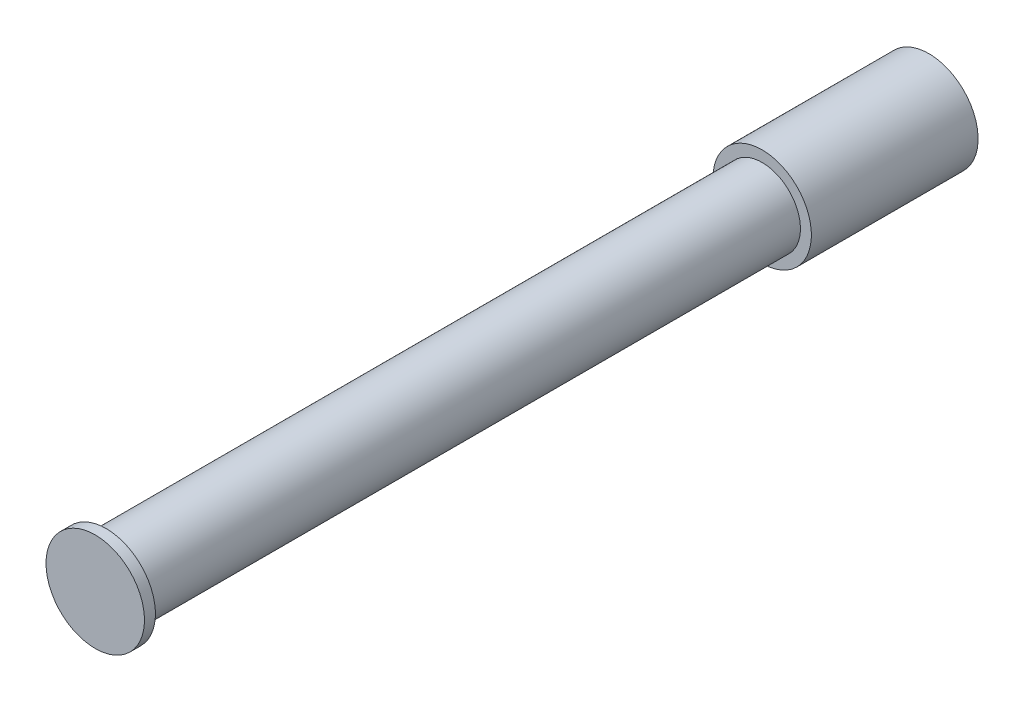
ISO-10303-21;
HEADER;
FILE_DESCRIPTION(('STEP AP214'),'2;1');
FILE_NAME('part.step','',(''),(''),'','','');
FILE_SCHEMA(('AUTOMOTIVE_DESIGN { 1 0 10303 214 1 1 1 1 }'));
ENDSEC;
DATA;
#1=APPLICATION_CONTEXT('core data for automotive mechanical design processes');
#2=APPLICATION_PROTOCOL_DEFINITION('international standard','automotive_design',2000,#1);
#3=PRODUCT_CONTEXT('',#1,'mechanical');
#4=PRODUCT('Part','Part','',(#3));
#5=PRODUCT_RELATED_PRODUCT_CATEGORY('part','',(#4));
#6=PRODUCT_DEFINITION_FORMATION('','',#4);
#7=PRODUCT_DEFINITION_CONTEXT('part definition',#1,'design');
#8=PRODUCT_DEFINITION('design','',#6,#7);
#9=PRODUCT_DEFINITION_SHAPE('','',#8);
#10=(LENGTH_UNIT() NAMED_UNIT(*) SI_UNIT(.MILLI.,.METRE.));
#11=(NAMED_UNIT(*) PLANE_ANGLE_UNIT() SI_UNIT($,.RADIAN.));
#12=(NAMED_UNIT(*) SI_UNIT($,.STERADIAN.) SOLID_ANGLE_UNIT());
#13=UNCERTAINTY_MEASURE_WITH_UNIT(LENGTH_MEASURE(1.E-05),#10,'distance_accuracy_value','');
#14=(GEOMETRIC_REPRESENTATION_CONTEXT(3) GLOBAL_UNCERTAINTY_ASSIGNED_CONTEXT((#13)) GLOBAL_UNIT_ASSIGNED_CONTEXT((#10,
#11,#12)) REPRESENTATION_CONTEXT('',''));
#15=CARTESIAN_POINT('',(0.,0.,0.));
#16=DIRECTION('',(0.,0.,1.));
#17=DIRECTION('',(1.,0.,0.));
#18=AXIS2_PLACEMENT_3D('',#15,#16,#17);
#19=CARTESIAN_POINT('',(0.,5.82639397322076,38.1));
#20=DIRECTION('',(0.,0.,-1.));
#21=DIRECTION('',(-1.,0.,0.));
#22=AXIS2_PLACEMENT_3D('',#19,#20,#21);
#23=CYLINDRICAL_SURFACE('',#22,2.25);
#24=CARTESIAN_POINT('',(0.,5.82639397322076,38.1));
#25=DIRECTION('',(0.,0.,1.));
#26=DIRECTION('',(1.,0.,0.));
#27=AXIS2_PLACEMENT_3D('',#24,#25,#26);
#28=CIRCLE('',#27,2.25);
#29=CARTESIAN_POINT('',(-2.24999999999994,5.82639397322076,38.1));
#30=VERTEX_POINT('',#29);
#31=EDGE_CURVE('E11',#30,#30,#28,.T.);
#32=CARTESIAN_POINT('',(0.,5.82639397322076,37.6));
#33=DIRECTION('',(0.,0.,-1.));
#34=DIRECTION('',(-1.,0.,0.));
#35=AXIS2_PLACEMENT_3D('',#32,#33,#34);
#36=CIRCLE('',#35,2.25);
#37=CARTESIAN_POINT('',(-2.24999999999994,5.82639397322076,37.6));
#38=VERTEX_POINT('',#37);
#39=EDGE_CURVE('E37',#38,#38,#36,.T.);
#40=CARTESIAN_POINT('',(-2.24999999999994,5.82639397322076,38.1));
#41=CARTESIAN_POINT('',(-2.24999999999994,5.82639397322076,38.0947916666667));
#42=CARTESIAN_POINT('',(-2.24999999999994,5.82639397322076,38.0895833333333));
#43=CARTESIAN_POINT('',(-2.24999999999994,5.82639397322076,38.0791666666667));
#44=CARTESIAN_POINT('',(-2.24999999999994,5.82639397322076,38.0739583333333));
#45=CARTESIAN_POINT('',(-2.24999999999994,5.82639397322076,38.0635416666667));
#46=CARTESIAN_POINT('',(-2.24999999999994,5.82639397322076,38.0583333333333));
#47=CARTESIAN_POINT('',(-2.24999999999994,5.82639397322076,38.0479166666667));
#48=CARTESIAN_POINT('',(-2.24999999999994,5.82639397322076,38.0427083333333));
#49=CARTESIAN_POINT('',(-2.24999999999994,5.82639397322076,38.0322916666667));
#50=CARTESIAN_POINT('',(-2.24999999999994,5.82639397322076,38.0270833333333));
#51=CARTESIAN_POINT('',(-2.24999999999994,5.82639397322076,38.0166666666667));
#52=CARTESIAN_POINT('',(-2.24999999999994,5.82639397322076,38.0114583333333));
#53=CARTESIAN_POINT('',(-2.24999999999994,5.82639397322076,38.0010416666667));
#54=CARTESIAN_POINT('',(-2.24999999999994,5.82639397322076,37.9958333333333));
#55=CARTESIAN_POINT('',(-2.24999999999994,5.82639397322076,37.9854166666667));
#56=CARTESIAN_POINT('',(-2.24999999999994,5.82639397322076,37.9802083333333));
#57=CARTESIAN_POINT('',(-2.24999999999994,5.82639397322076,37.9697916666667));
#58=CARTESIAN_POINT('',(-2.24999999999994,5.82639397322076,37.9645833333333));
#59=CARTESIAN_POINT('',(-2.24999999999994,5.82639397322076,37.9541666666667));
#60=CARTESIAN_POINT('',(-2.24999999999994,5.82639397322076,37.9489583333333));
#61=CARTESIAN_POINT('',(-2.24999999999994,5.82639397322076,37.9385416666667));
#62=CARTESIAN_POINT('',(-2.24999999999994,5.82639397322076,37.9333333333333));
#63=CARTESIAN_POINT('',(-2.24999999999994,5.82639397322076,37.9229166666667));
#64=CARTESIAN_POINT('',(-2.24999999999994,5.82639397322076,37.9177083333333));
#65=CARTESIAN_POINT('',(-2.24999999999994,5.82639397322076,37.9072916666667));
#66=CARTESIAN_POINT('',(-2.24999999999994,5.82639397322076,37.9020833333333));
#67=CARTESIAN_POINT('',(-2.24999999999994,5.82639397322076,37.8916666666667));
#68=CARTESIAN_POINT('',(-2.24999999999994,5.82639397322076,37.8864583333333));
#69=CARTESIAN_POINT('',(-2.24999999999994,5.82639397322076,37.8760416666667));
#70=CARTESIAN_POINT('',(-2.24999999999994,5.82639397322076,37.8708333333333));
#71=CARTESIAN_POINT('',(-2.24999999999994,5.82639397322076,37.8604166666667));
#72=CARTESIAN_POINT('',(-2.24999999999994,5.82639397322076,37.8552083333333));
#73=CARTESIAN_POINT('',(-2.24999999999994,5.82639397322076,37.8447916666667));
#74=CARTESIAN_POINT('',(-2.24999999999994,5.82639397322076,37.8395833333333));
#75=CARTESIAN_POINT('',(-2.24999999999994,5.82639397322076,37.8291666666667));
#76=CARTESIAN_POINT('',(-2.24999999999994,5.82639397322076,37.8239583333333));
#77=CARTESIAN_POINT('',(-2.24999999999994,5.82639397322076,37.8135416666667));
#78=CARTESIAN_POINT('',(-2.24999999999994,5.82639397322076,37.8083333333333));
#79=CARTESIAN_POINT('',(-2.24999999999994,5.82639397322076,37.7979166666667));
#80=CARTESIAN_POINT('',(-2.24999999999994,5.82639397322076,37.7927083333333));
#81=CARTESIAN_POINT('',(-2.24999999999994,5.82639397322076,37.7822916666667));
#82=CARTESIAN_POINT('',(-2.24999999999994,5.82639397322076,37.7770833333333));
#83=CARTESIAN_POINT('',(-2.24999999999994,5.82639397322076,37.7666666666667));
#84=CARTESIAN_POINT('',(-2.24999999999994,5.82639397322076,37.7614583333333));
#85=CARTESIAN_POINT('',(-2.24999999999994,5.82639397322076,37.7510416666667));
#86=CARTESIAN_POINT('',(-2.24999999999994,5.82639397322076,37.7458333333333));
#87=CARTESIAN_POINT('',(-2.24999999999994,5.82639397322076,37.7354166666667));
#88=CARTESIAN_POINT('',(-2.24999999999994,5.82639397322076,37.7302083333333));
#89=CARTESIAN_POINT('',(-2.24999999999994,5.82639397322076,37.7197916666667));
#90=CARTESIAN_POINT('',(-2.24999999999994,5.82639397322076,37.7145833333333));
#91=CARTESIAN_POINT('',(-2.24999999999994,5.82639397322076,37.7041666666667));
#92=CARTESIAN_POINT('',(-2.24999999999994,5.82639397322076,37.6989583333333));
#93=CARTESIAN_POINT('',(-2.24999999999994,5.82639397322076,37.6885416666667));
#94=CARTESIAN_POINT('',(-2.24999999999994,5.82639397322076,37.6833333333333));
#95=CARTESIAN_POINT('',(-2.24999999999994,5.82639397322076,37.6729166666667));
#96=CARTESIAN_POINT('',(-2.24999999999994,5.82639397322076,37.6677083333333));
#97=CARTESIAN_POINT('',(-2.24999999999994,5.82639397322076,37.6572916666667));
#98=CARTESIAN_POINT('',(-2.24999999999994,5.82639397322076,37.6520833333333));
#99=CARTESIAN_POINT('',(-2.24999999999994,5.82639397322076,37.6416666666667));
#100=CARTESIAN_POINT('',(-2.24999999999994,5.82639397322076,37.6364583333333));
#101=CARTESIAN_POINT('',(-2.24999999999994,5.82639397322076,37.6260416666667));
#102=CARTESIAN_POINT('',(-2.24999999999994,5.82639397322076,37.6208333333333));
#103=CARTESIAN_POINT('',(-2.24999999999994,5.82639397322076,37.6104166666667));
#104=CARTESIAN_POINT('',(-2.24999999999994,5.82639397322076,37.6052083333333));
#105=CARTESIAN_POINT('',(-2.24999999999994,5.82639397322076,37.6));
#106=B_SPLINE_CURVE_WITH_KNOTS('',3,(#40,#41,#42,#43,#44,#45,#46,#47,#48,#49,#50,#51,#52,#53,
#54,#55,#56,#57,#58,#59,#60,#61,#62,#63,#64,#65,#66,#67,#68,#69,#70,#71,#72,#73,#74,#75,#76,#77,
#78,#79,#80,#81,#82,#83,#84,#85,#86,#87,#88,#89,#90,#91,#92,#93,#94,#95,#96,#97,#98,#99,#100,
#101,#102,#103,#104,#105),.UNSPECIFIED.,.F.,.F.,(4,2,2,2,2,2,2,2,2,2,2,2,2,2,2,2,2,2,2,2,2,2,2,
2,2,2,2,2,2,2,2,2,4),(0.,0.0156250000000052,0.0312500000000035,0.0468750000000018,
0.0625000000000001,0.0781250000000053,0.0937500000000036,0.109375000000002,0.125,
0.140625000000005,0.156250000000004,0.171875000000002,0.1875,0.203125000000005,
0.218750000000004,0.234375000000002,0.25,0.265625000000005,0.281250000000004,0.296875000000002,
0.3125,0.328125000000005,0.343750000000004,0.359375000000002,0.375,0.390625000000006,
0.406250000000004,0.421875000000002,0.4375,0.453125000000006,0.468750000000004,
0.484375000000002,0.5),.UNSPECIFIED.);
#107=EDGE_CURVE('BSEAM33',#30,#38,#106,.T.);
#108=ORIENTED_EDGE('',*,*,#31,.F.);
#109=ORIENTED_EDGE('',*,*,#39,.F.);
#110=ORIENTED_EDGE('',*,*,#107,.T.);
#111=ORIENTED_EDGE('',*,*,#107,.F.);
#112=EDGE_LOOP('',(#108,#110,#109,#111));
#113=FACE_BOUND('',#112,.T.);
#114=ADVANCED_FACE('F33',(#113),#23,.T.);
#115=CARTESIAN_POINT('',(0.,5.82639397322076,38.1));
#116=DIRECTION('',(0.,0.,1.));
#117=DIRECTION('',(1.,0.,0.));
#118=AXIS2_PLACEMENT_3D('',#115,#116,#117);
#119=PLANE('',#118);
#120=ORIENTED_EDGE('',*,*,#31,.T.);
#121=EDGE_LOOP('',(#120));
#122=FACE_BOUND('',#121,.T.);
#123=ADVANCED_FACE('F78',(#122),#119,.T.);
#124=CARTESIAN_POINT('',(0.,5.82639397322076,37.6));
#125=DIRECTION('',(0.,0.,-1.));
#126=DIRECTION('',(-1.,0.,0.));
#127=AXIS2_PLACEMENT_3D('',#124,#125,#126);
#128=PLANE('',#127);
#129=CARTESIAN_POINT('',(0.,5.82639397322076,37.6));
#130=DIRECTION('',(0.,0.,-1.));
#131=DIRECTION('',(-1.,0.,0.));
#132=AXIS2_PLACEMENT_3D('',#129,#130,#131);
#133=CIRCLE('',#132,1.75);
#134=CARTESIAN_POINT('',(-1.74999999999994,5.82639397322076,37.6));
#135=VERTEX_POINT('',#134);
#136=EDGE_CURVE('E52',#135,#135,#133,.T.);
#137=ORIENTED_EDGE('',*,*,#136,.F.);
#138=EDGE_LOOP('',(#137));
#139=FACE_BOUND('',#138,.T.);
#140=ORIENTED_EDGE('',*,*,#39,.T.);
#141=EDGE_LOOP('',(#140));
#142=FACE_BOUND('',#141,.T.);
#143=ADVANCED_FACE('F74',(#139,#142),#128,.T.);
#144=CARTESIAN_POINT('',(0.,5.82639397322076,7.62));
#145=DIRECTION('',(0.,0.,-1.));
#146=DIRECTION('',(-1.,0.,0.));
#147=AXIS2_PLACEMENT_3D('',#144,#145,#146);
#148=PLANE('',#147);
#149=CARTESIAN_POINT('',(0.,5.82639397322076,7.62));
#150=DIRECTION('',(0.,0.,-1.));
#151=DIRECTION('',(-1.,0.,0.));
#152=AXIS2_PLACEMENT_3D('',#149,#150,#151);
#153=CIRCLE('',#152,1.75);
#154=CARTESIAN_POINT('',(-1.74999999999994,5.82639397322076,7.62));
#155=VERTEX_POINT('',#154);
#156=EDGE_CURVE('E48',#155,#155,#153,.T.);
#157=ORIENTED_EDGE('',*,*,#156,.T.);
#158=EDGE_LOOP('',(#157));
#159=FACE_BOUND('',#158,.T.);
#160=CARTESIAN_POINT('',(0.,5.82639397322076,7.62));
#161=DIRECTION('',(0.,0.,-1.));
#162=DIRECTION('',(-1.,0.,0.));
#163=AXIS2_PLACEMENT_3D('',#160,#161,#162);
#164=CIRCLE('',#163,2.25);
#165=CARTESIAN_POINT('',(-2.24999999999994,5.82639397322076,7.62));
#166=VERTEX_POINT('',#165);
#167=EDGE_CURVE('E50',#166,#166,#164,.T.);
#168=ORIENTED_EDGE('',*,*,#167,.F.);
#169=EDGE_LOOP('',(#168));
#170=FACE_BOUND('',#169,.T.);
#171=ADVANCED_FACE('F62',(#159,#170),#148,.F.);
#172=CARTESIAN_POINT('',(0.,5.82639397322076,37.6));
#173=DIRECTION('',(0.,0.,-1.));
#174=DIRECTION('',(-1.,0.,0.));
#175=AXIS2_PLACEMENT_3D('',#172,#173,#174);
#176=CYLINDRICAL_SURFACE('',#175,1.75);
#177=CARTESIAN_POINT('',(-1.74999999999994,5.82639397322076,37.6));
#178=CARTESIAN_POINT('',(-1.74999999999994,5.82639397322076,37.2877083333333));
#179=CARTESIAN_POINT('',(-1.74999999999994,5.82639397322076,36.9754166666667));
#180=CARTESIAN_POINT('',(-1.74999999999994,5.82639397322076,36.3508333333333));
#181=CARTESIAN_POINT('',(-1.74999999999994,5.82639397322076,36.0385416666667));
#182=CARTESIAN_POINT('',(-1.74999999999994,5.82639397322076,35.4139583333333));
#183=CARTESIAN_POINT('',(-1.74999999999994,5.82639397322076,35.1016666666667));
#184=CARTESIAN_POINT('',(-1.74999999999994,5.82639397322076,34.4770833333333));
#185=CARTESIAN_POINT('',(-1.74999999999994,5.82639397322076,34.1647916666667));
#186=CARTESIAN_POINT('',(-1.74999999999994,5.82639397322076,33.5402083333333));
#187=CARTESIAN_POINT('',(-1.74999999999994,5.82639397322076,33.2279166666667));
#188=CARTESIAN_POINT('',(-1.74999999999994,5.82639397322076,32.6033333333333));
#189=CARTESIAN_POINT('',(-1.74999999999994,5.82639397322076,32.2910416666667));
#190=CARTESIAN_POINT('',(-1.74999999999994,5.82639397322076,31.6664583333333));
#191=CARTESIAN_POINT('',(-1.74999999999994,5.82639397322076,31.3541666666667));
#192=CARTESIAN_POINT('',(-1.74999999999994,5.82639397322076,30.7295833333333));
#193=CARTESIAN_POINT('',(-1.74999999999994,5.82639397322076,30.4172916666667));
#194=CARTESIAN_POINT('',(-1.74999999999994,5.82639397322076,29.7927083333333));
#195=CARTESIAN_POINT('',(-1.74999999999994,5.82639397322076,29.4804166666667));
#196=CARTESIAN_POINT('',(-1.74999999999994,5.82639397322076,28.8558333333333));
#197=CARTESIAN_POINT('',(-1.74999999999994,5.82639397322076,28.5435416666667));
#198=CARTESIAN_POINT('',(-1.74999999999994,5.82639397322076,27.9189583333333));
#199=CARTESIAN_POINT('',(-1.74999999999994,5.82639397322076,27.6066666666667));
#200=CARTESIAN_POINT('',(-1.74999999999994,5.82639397322076,26.9820833333333));
#201=CARTESIAN_POINT('',(-1.74999999999994,5.82639397322076,26.6697916666667));
#202=CARTESIAN_POINT('',(-1.74999999999994,5.82639397322076,26.0452083333333));
#203=CARTESIAN_POINT('',(-1.74999999999994,5.82639397322076,25.7329166666667));
#204=CARTESIAN_POINT('',(-1.74999999999994,5.82639397322076,25.1083333333333));
#205=CARTESIAN_POINT('',(-1.74999999999994,5.82639397322076,24.7960416666667));
#206=CARTESIAN_POINT('',(-1.74999999999994,5.82639397322076,24.1714583333333));
#207=CARTESIAN_POINT('',(-1.74999999999994,5.82639397322076,23.8591666666667));
#208=CARTESIAN_POINT('',(-1.74999999999994,5.82639397322076,23.2345833333333));
#209=CARTESIAN_POINT('',(-1.74999999999994,5.82639397322076,22.9222916666667));
#210=CARTESIAN_POINT('',(-1.74999999999994,5.82639397322076,22.2977083333333));
#211=CARTESIAN_POINT('',(-1.74999999999994,5.82639397322076,21.9854166666667));
#212=CARTESIAN_POINT('',(-1.74999999999994,5.82639397322076,21.3608333333333));
#213=CARTESIAN_POINT('',(-1.74999999999994,5.82639397322076,21.0485416666667));
#214=CARTESIAN_POINT('',(-1.74999999999994,5.82639397322076,20.4239583333333));
#215=CARTESIAN_POINT('',(-1.74999999999994,5.82639397322076,20.1116666666667));
#216=CARTESIAN_POINT('',(-1.74999999999994,5.82639397322076,19.4870833333333));
#217=CARTESIAN_POINT('',(-1.74999999999994,5.82639397322076,19.1747916666667));
#218=CARTESIAN_POINT('',(-1.74999999999994,5.82639397322076,18.5502083333333));
#219=CARTESIAN_POINT('',(-1.74999999999994,5.82639397322076,18.2379166666667));
#220=CARTESIAN_POINT('',(-1.74999999999994,5.82639397322076,17.6133333333333));
#221=CARTESIAN_POINT('',(-1.74999999999994,5.82639397322076,17.3010416666667));
#222=CARTESIAN_POINT('',(-1.74999999999994,5.82639397322076,16.6764583333333));
#223=CARTESIAN_POINT('',(-1.74999999999994,5.82639397322076,16.3641666666667));
#224=CARTESIAN_POINT('',(-1.74999999999994,5.82639397322076,15.7395833333333));
#225=CARTESIAN_POINT('',(-1.74999999999994,5.82639397322076,15.4272916666667));
#226=CARTESIAN_POINT('',(-1.74999999999994,5.82639397322076,14.8027083333333));
#227=CARTESIAN_POINT('',(-1.74999999999994,5.82639397322076,14.4904166666667));
#228=CARTESIAN_POINT('',(-1.74999999999994,5.82639397322076,13.8658333333333));
#229=CARTESIAN_POINT('',(-1.74999999999994,5.82639397322076,13.5535416666667));
#230=CARTESIAN_POINT('',(-1.74999999999994,5.82639397322076,12.9289583333333));
#231=CARTESIAN_POINT('',(-1.74999999999994,5.82639397322076,12.6166666666667));
#232=CARTESIAN_POINT('',(-1.74999999999994,5.82639397322076,11.9920833333333));
#233=CARTESIAN_POINT('',(-1.74999999999994,5.82639397322076,11.6797916666667));
#234=CARTESIAN_POINT('',(-1.74999999999994,5.82639397322076,11.0552083333333));
#235=CARTESIAN_POINT('',(-1.74999999999994,5.82639397322076,10.7429166666667));
#236=CARTESIAN_POINT('',(-1.74999999999994,5.82639397322076,10.1183333333333));
#237=CARTESIAN_POINT('',(-1.74999999999994,5.82639397322076,9.80604166666667));
#238=CARTESIAN_POINT('',(-1.74999999999994,5.82639397322076,9.18145833333333));
#239=CARTESIAN_POINT('',(-1.74999999999994,5.82639397322076,8.86916666666667));
#240=CARTESIAN_POINT('',(-1.74999999999994,5.82639397322076,8.24458333333333));
#241=CARTESIAN_POINT('',(-1.74999999999994,5.82639397322076,7.93229166666667));
#242=CARTESIAN_POINT('',(-1.74999999999994,5.82639397322076,7.62));
#243=B_SPLINE_CURVE_WITH_KNOTS('',3,(#177,#178,#179,#180,#181,#182,#183,#184,#185,#186,#187,
#188,#189,#190,#191,#192,#193,#194,#195,#196,#197,#198,#199,#200,#201,#202,#203,#204,#205,#206,
#207,#208,#209,#210,#211,#212,#213,#214,#215,#216,#217,#218,#219,#220,#221,#222,#223,#224,#225,
#226,#227,#228,#229,#230,#231,#232,#233,#234,#235,#236,#237,#238,#239,#240,#241,#242),
.UNSPECIFIED.,.F.,.F.,(4,2,2,2,2,2,2,2,2,2,2,2,2,2,2,2,2,2,2,2,2,2,2,2,2,2,2,2,2,2,2,2,4),(0.,
0.936875000000004,1.87375,2.810625,3.7475,4.684375,5.62125,6.558125,7.495,8.431875,9.36875,
10.305625,11.2425,12.179375,13.11625,14.053125,14.99,15.926875,16.86375,17.800625,18.7375,
19.674375,20.61125,21.548125,22.485,23.421875,24.35875,25.295625,26.2325,27.169375,28.10625,
29.043125,29.98),.UNSPECIFIED.);
#244=EDGE_CURVE('BSEAM65',#135,#155,#243,.T.);
#245=ORIENTED_EDGE('',*,*,#136,.T.);
#246=ORIENTED_EDGE('',*,*,#156,.F.);
#247=ORIENTED_EDGE('',*,*,#244,.T.);
#248=ORIENTED_EDGE('',*,*,#244,.F.);
#249=EDGE_LOOP('',(#245,#247,#246,#248));
#250=FACE_BOUND('',#249,.T.);
#251=ADVANCED_FACE('F65',(#250),#176,.T.);
#252=CARTESIAN_POINT('',(0.,5.82639397322076,0.));
#253=DIRECTION('',(0.,0.,1.));
#254=DIRECTION('',(1.,0.,0.));
#255=AXIS2_PLACEMENT_3D('',#252,#253,#254);
#256=PLANE('',#255);
#257=CARTESIAN_POINT('',(0.,5.82639397322076,0.));
#258=DIRECTION('',(0.,0.,1.));
#259=DIRECTION('',(1.,0.,0.));
#260=AXIS2_PLACEMENT_3D('',#257,#258,#259);
#261=CIRCLE('',#260,2.25);
#262=CARTESIAN_POINT('',(-2.24999999999994,5.82639397322076,0.));
#263=VERTEX_POINT('',#262);
#264=EDGE_CURVE('E41',#263,#263,#261,.T.);
#265=ORIENTED_EDGE('',*,*,#264,.F.);
#266=EDGE_LOOP('',(#265));
#267=FACE_BOUND('',#266,.T.);
#268=ADVANCED_FACE('F67',(#267),#256,.F.);
#269=CARTESIAN_POINT('',(-2.24999999999994,5.82639397322076,7.62));
#270=CARTESIAN_POINT('',(-2.24999999999994,5.82639397322076,7.540625));
#271=CARTESIAN_POINT('',(-2.24999999999994,5.82639397322076,7.46125));
#272=CARTESIAN_POINT('',(-2.24999999999994,5.82639397322076,7.3025));
#273=CARTESIAN_POINT('',(-2.24999999999994,5.82639397322076,7.223125));
#274=CARTESIAN_POINT('',(-2.24999999999994,5.82639397322076,7.064375));
#275=CARTESIAN_POINT('',(-2.24999999999994,5.82639397322076,6.985));
#276=CARTESIAN_POINT('',(-2.24999999999994,5.82639397322076,6.82625));
#277=CARTESIAN_POINT('',(-2.24999999999994,5.82639397322076,6.746875));
#278=CARTESIAN_POINT('',(-2.24999999999994,5.82639397322076,6.588125));
#279=CARTESIAN_POINT('',(-2.24999999999994,5.82639397322076,6.50875));
#280=CARTESIAN_POINT('',(-2.24999999999994,5.82639397322076,6.35));
#281=CARTESIAN_POINT('',(-2.24999999999994,5.82639397322076,6.270625));
#282=CARTESIAN_POINT('',(-2.24999999999994,5.82639397322076,6.111875));
#283=CARTESIAN_POINT('',(-2.24999999999994,5.82639397322076,6.0325));
#284=CARTESIAN_POINT('',(-2.24999999999994,5.82639397322076,5.87375));
#285=CARTESIAN_POINT('',(-2.24999999999994,5.82639397322076,5.794375));
#286=CARTESIAN_POINT('',(-2.24999999999994,5.82639397322076,5.635625));
#287=CARTESIAN_POINT('',(-2.24999999999994,5.82639397322076,5.55625));
#288=CARTESIAN_POINT('',(-2.24999999999994,5.82639397322076,5.3975));
#289=CARTESIAN_POINT('',(-2.24999999999994,5.82639397322076,5.318125));
#290=CARTESIAN_POINT('',(-2.24999999999994,5.82639397322076,5.159375));
#291=CARTESIAN_POINT('',(-2.24999999999994,5.82639397322076,5.08));
#292=CARTESIAN_POINT('',(-2.24999999999994,5.82639397322076,4.92125));
#293=CARTESIAN_POINT('',(-2.24999999999994,5.82639397322076,4.841875));
#294=CARTESIAN_POINT('',(-2.24999999999994,5.82639397322076,4.683125));
#295=CARTESIAN_POINT('',(-2.24999999999994,5.82639397322076,4.60375));
#296=CARTESIAN_POINT('',(-2.24999999999994,5.82639397322076,4.445));
#297=CARTESIAN_POINT('',(-2.24999999999994,5.82639397322076,4.365625));
#298=CARTESIAN_POINT('',(-2.24999999999994,5.82639397322076,4.206875));
#299=CARTESIAN_POINT('',(-2.24999999999994,5.82639397322076,4.1275));
#300=CARTESIAN_POINT('',(-2.24999999999994,5.82639397322076,3.96875));
#301=CARTESIAN_POINT('',(-2.24999999999994,5.82639397322076,3.889375));
#302=CARTESIAN_POINT('',(-2.24999999999994,5.82639397322076,3.730625));
#303=CARTESIAN_POINT('',(-2.24999999999994,5.82639397322076,3.65125));
#304=CARTESIAN_POINT('',(-2.24999999999994,5.82639397322076,3.4925));
#305=CARTESIAN_POINT('',(-2.24999999999994,5.82639397322076,3.413125));
#306=CARTESIAN_POINT('',(-2.24999999999994,5.82639397322076,3.254375));
#307=CARTESIAN_POINT('',(-2.24999999999994,5.82639397322076,3.175));
#308=CARTESIAN_POINT('',(-2.24999999999994,5.82639397322076,3.01625));
#309=CARTESIAN_POINT('',(-2.24999999999994,5.82639397322076,2.936875));
#310=CARTESIAN_POINT('',(-2.24999999999994,5.82639397322076,2.778125));
#311=CARTESIAN_POINT('',(-2.24999999999994,5.82639397322076,2.69875));
#312=CARTESIAN_POINT('',(-2.24999999999994,5.82639397322076,2.54));
#313=CARTESIAN_POINT('',(-2.24999999999994,5.82639397322076,2.460625));
#314=CARTESIAN_POINT('',(-2.24999999999994,5.82639397322076,2.301875));
#315=CARTESIAN_POINT('',(-2.24999999999994,5.82639397322076,2.2225));
#316=CARTESIAN_POINT('',(-2.24999999999994,5.82639397322076,2.06375));
#317=CARTESIAN_POINT('',(-2.24999999999994,5.82639397322076,1.984375));
#318=CARTESIAN_POINT('',(-2.24999999999994,5.82639397322076,1.825625));
#319=CARTESIAN_POINT('',(-2.24999999999994,5.82639397322076,1.74625));
#320=CARTESIAN_POINT('',(-2.24999999999994,5.82639397322076,1.5875));
#321=CARTESIAN_POINT('',(-2.24999999999994,5.82639397322076,1.508125));
#322=CARTESIAN_POINT('',(-2.24999999999994,5.82639397322076,1.349375));
#323=CARTESIAN_POINT('',(-2.24999999999994,5.82639397322076,1.27));
#324=CARTESIAN_POINT('',(-2.24999999999994,5.82639397322076,1.11125));
#325=CARTESIAN_POINT('',(-2.24999999999994,5.82639397322076,1.031875));
#326=CARTESIAN_POINT('',(-2.24999999999994,5.82639397322076,0.873125000000002));
#327=CARTESIAN_POINT('',(-2.24999999999994,5.82639397322076,0.793750000000003));
#328=CARTESIAN_POINT('',(-2.24999999999994,5.82639397322076,0.635000000000001));
#329=CARTESIAN_POINT('',(-2.24999999999994,5.82639397322076,0.555624999999999));
#330=CARTESIAN_POINT('',(-2.24999999999994,5.82639397322076,0.396874999999998));
#331=CARTESIAN_POINT('',(-2.24999999999994,5.82639397322076,0.317499999999998));
#332=CARTESIAN_POINT('',(-2.24999999999994,5.82639397322076,0.158749999999999));
#333=CARTESIAN_POINT('',(-2.24999999999994,5.82639397322076,0.0793749999999996));
#334=CARTESIAN_POINT('',(-2.24999999999994,5.82639397322076,0.));
#335=B_SPLINE_CURVE_WITH_KNOTS('',3,(#269,#270,#271,#272,#273,#274,#275,#276,#277,#278,#279,
#280,#281,#282,#283,#284,#285,#286,#287,#288,#289,#290,#291,#292,#293,#294,#295,#296,#297,#298,
#299,#300,#301,#302,#303,#304,#305,#306,#307,#308,#309,#310,#311,#312,#313,#314,#315,#316,#317,
#318,#319,#320,#321,#322,#323,#324,#325,#326,#327,#328,#329,#330,#331,#332,#333,#334),
.UNSPECIFIED.,.F.,.F.,(4,2,2,2,2,2,2,2,2,2,2,2,2,2,2,2,2,2,2,2,2,2,2,2,2,2,2,2,2,2,2,2,4),(0.,
0.238124999999999,0.476250000000001,0.714375,0.952499999999998,1.190625,1.42875,
1.66687499999999,1.905,2.143125,2.38125,2.619375,2.8575,3.09562499999999,3.33375,3.571875,3.81,
4.048125,4.28624999999999,4.52437499999999,4.7625,5.000625,5.23875,5.476875,5.71499999999999,
5.953125,6.19125,6.429375,6.6675,6.905625,7.14375,7.381875,7.62),.UNSPECIFIED.);
#336=EDGE_CURVE('BSEAM35',#166,#263,#335,.T.);
#337=ORIENTED_EDGE('',*,*,#167,.T.);
#338=ORIENTED_EDGE('',*,*,#264,.T.);
#339=ORIENTED_EDGE('',*,*,#336,.T.);
#340=ORIENTED_EDGE('',*,*,#336,.F.);
#341=EDGE_LOOP('',(#337,#339,#338,#340));
#342=FACE_BOUND('',#341,.T.);
#343=ADVANCED_FACE('F35',(#342),#23,.T.);
#344=CLOSED_SHELL('',(#114,#123,#143,#171,#251,#268,#343));
#345=MANIFOLD_SOLID_BREP('B2',#344);
#346=ADVANCED_BREP_SHAPE_REPRESENTATION('',(#18,#345),#14);
#347=SHAPE_DEFINITION_REPRESENTATION(#9,#346);
ENDSEC;
END-ISO-10303-21;
